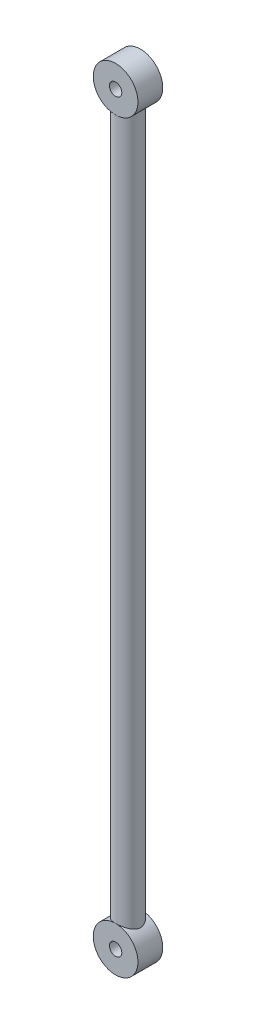
ISO-10303-21;
HEADER;
FILE_DESCRIPTION(('STEP AP214'),'2;1');
FILE_NAME('part.step','',(''),(''),'','','');
FILE_SCHEMA(('AUTOMOTIVE_DESIGN { 1 0 10303 214 1 1 1 1 }'));
ENDSEC;
DATA;
#1=APPLICATION_CONTEXT('core data for automotive mechanical design processes');
#2=APPLICATION_PROTOCOL_DEFINITION('international standard','automotive_design',2000,#1);
#3=PRODUCT_CONTEXT('',#1,'mechanical');
#4=PRODUCT('Part','Part','',(#3));
#5=PRODUCT_RELATED_PRODUCT_CATEGORY('part','',(#4));
#6=PRODUCT_DEFINITION_FORMATION('','',#4);
#7=PRODUCT_DEFINITION_CONTEXT('part definition',#1,'design');
#8=PRODUCT_DEFINITION('design','',#6,#7);
#9=PRODUCT_DEFINITION_SHAPE('','',#8);
#10=(LENGTH_UNIT() NAMED_UNIT(*) SI_UNIT(.MILLI.,.METRE.));
#11=(NAMED_UNIT(*) PLANE_ANGLE_UNIT() SI_UNIT($,.RADIAN.));
#12=(NAMED_UNIT(*) SI_UNIT($,.STERADIAN.) SOLID_ANGLE_UNIT());
#13=UNCERTAINTY_MEASURE_WITH_UNIT(LENGTH_MEASURE(1.E-05),#10,'distance_accuracy_value','');
#14=(GEOMETRIC_REPRESENTATION_CONTEXT(3) GLOBAL_UNCERTAINTY_ASSIGNED_CONTEXT((#13)) GLOBAL_UNIT_ASSIGNED_CONTEXT((#10,
#11,#12)) REPRESENTATION_CONTEXT('',''));
#15=CARTESIAN_POINT('',(0.,0.,0.));
#16=DIRECTION('',(0.,0.,1.));
#17=DIRECTION('',(1.,0.,0.));
#18=AXIS2_PLACEMENT_3D('',#15,#16,#17);
#19=CARTESIAN_POINT('',(0.,150.,0.));
#20=DIRECTION('',(0.,-1.,0.));
#21=DIRECTION('',(0.,0.,-1.));
#22=AXIS2_PLACEMENT_3D('',#19,#20,#21);
#23=CYLINDRICAL_SURFACE('',#22,5.);
#24=CARTESIAN_POINT('',(0.,141.,-5.));
#25=CARTESIAN_POINT('',(-0.129728650098871,140.999999646326,-5.00000040349837));
#26=CARTESIAN_POINT('',(-0.259452073794094,141.002810835245,-4.99494572915852));
#27=CARTESIAN_POINT('',(-0.517921555695225,141.013983381543,-4.9747929956815));
#28=CARTESIAN_POINT('',(-0.646667254114373,141.022346690576,-4.95969140489748));
#29=CARTESIAN_POINT('',(-0.902114816809583,141.044408368666,-4.91964430657611));
#30=CARTESIAN_POINT('',(-1.02881719751598,141.058105366955,-4.89470132827136));
#31=CARTESIAN_POINT('',(-1.27935747075157,141.090498897505,-4.83526936572432));
#32=CARTESIAN_POINT('',(-1.40319416175913,141.109197486989,-4.80077645325704));
#33=CARTESIAN_POINT('',(-1.64664425181187,141.151059393311,-4.72279881871315));
#34=CARTESIAN_POINT('',(-1.76627303289197,141.174203876621,-4.67935197230107));
#35=CARTESIAN_POINT('',(-2.00118015325758,141.224480930736,-4.58381684319522));
#36=CARTESIAN_POINT('',(-2.11645683188321,141.251615004926,-4.53172530199133));
#37=CARTESIAN_POINT('',(-2.45478877397503,141.33812636229,-4.36318845033186));
#38=CARTESIAN_POINT('',(-2.67053417661057,141.402646532724,-4.23441988189425));
#39=CARTESIAN_POINT('',(-3.09271229088071,141.544927587781,-3.93780768634661));
#40=CARTESIAN_POINT('',(-3.29745415964199,141.623297217141,-3.76786951560456));
#41=CARTESIAN_POINT('',(-3.67715998948636,141.782885936079,-3.39835387418638));
#42=CARTESIAN_POINT('',(-3.85209353794295,141.864107835081,-3.19874651689415));
#43=CARTESIAN_POINT('',(-4.18516795747926,142.029907367738,-2.75130582658808));
#44=CARTESIAN_POINT('',(-4.33981028101033,142.113990877573,-2.5006351634021));
#45=CARTESIAN_POINT('',(-4.53792036965586,142.227413371803,-2.10454112170272));
#46=CARTESIAN_POINT('',(-4.59831134885591,142.263101389869,-1.96917342161965));
#47=CARTESIAN_POINT('',(-4.70719976108134,142.328866191986,-1.69244684576201));
#48=CARTESIAN_POINT('',(-4.75570081097955,142.358944681767,-1.55108980730638));
#49=CARTESIAN_POINT('',(-4.86451848682886,142.42749900523,-1.17999431654652));
#50=CARTESIAN_POINT('',(-4.9154532780422,142.460775105057,-0.946409780324293));
#51=CARTESIAN_POINT('',(-4.98336969334309,142.505486049894,-0.472499613023781));
#52=CARTESIAN_POINT('',(-5.0003847861741,142.516942424044,-0.232180864358255));
#53=CARTESIAN_POINT('',(-4.99960164647186,142.516418963688,0.248654352078251));
#54=CARTESIAN_POINT('',(-4.98176529219689,142.504413465757,0.489170748384894));
#55=CARTESIAN_POINT('',(-4.91220969738461,142.458656700871,0.963158075959368));
#56=CARTESIAN_POINT('',(-4.8604684245036,142.424891293967,1.19662432257893));
#57=CARTESIAN_POINT('',(-4.72555331937599,142.340011492925,1.65086354474707));
#58=CARTESIAN_POINT('',(-4.64237249870864,142.288893241833,1.87163368561019));
#59=CARTESIAN_POINT('',(-4.447403175792,142.17482733877,2.29681665358057));
#60=CARTESIAN_POINT('',(-4.33560350009452,142.111875069086,2.50122305090145));
#61=CARTESIAN_POINT('',(-4.06693738507513,141.969652579496,2.92082028624938));
#62=CARTESIAN_POINT('',(-3.90580419516379,141.889356384365,3.13292950403355));
#63=CARTESIAN_POINT('',(-3.55190169354531,141.728256034713,3.52909892787892));
#64=CARTESIAN_POINT('',(-3.35910741508493,141.647451528109,3.7131367752038));
#65=CARTESIAN_POINT('',(-3.0382033469624,141.527444052296,3.97377961796348));
#66=CARTESIAN_POINT('',(-2.91988181005325,141.485842006656,4.06153890281824));
#67=CARTESIAN_POINT('',(-2.67521853140364,141.405831009375,4.22669686748395));
#68=CARTESIAN_POINT('',(-2.54887988004624,141.367420840379,4.30409950416806));
#69=CARTESIAN_POINT('',(-2.28891079019197,141.294880885918,4.44780208557034));
#70=CARTESIAN_POINT('',(-2.15528226330416,141.260749985978,4.51410492258729));
#71=CARTESIAN_POINT('',(-1.88158110652946,141.197763927142,4.63486956287611));
#72=CARTESIAN_POINT('',(-1.7415092634169,141.168908126247,4.68933280722001));
#73=CARTESIAN_POINT('',(-1.46611496312218,141.119196102882,4.78227003245317));
#74=CARTESIAN_POINT('',(-1.33115857131804,141.097918104151,4.82160315398791));
#75=CARTESIAN_POINT('',(-1.05765459084795,141.061297953465,4.88888456177408));
#76=CARTESIAN_POINT('',(-0.919107474489868,141.045955025022,4.91683433733713));
#77=CARTESIAN_POINT('',(-0.639688147055673,141.021667657509,4.96092635164273));
#78=CARTESIAN_POINT('',(-0.498817610939271,141.012718798921,4.97707674617504));
#79=CARTESIAN_POINT('',(-0.215954097478516,141.001478427607,4.99734561333519));
#80=CARTESIAN_POINT('',(-0.0739612319194169,140.999186260042,5.00146526946591));
#81=CARTESIAN_POINT('',(0.193661310485743,141.001204594039,4.99783122654234));
#82=CARTESIAN_POINT('',(0.319316398566548,141.004794217097,4.99137388810731));
#83=CARTESIAN_POINT('',(0.569568337701498,141.017166848495,4.96904196300947));
#84=CARTESIAN_POINT('',(0.694164850128328,141.025951459577,4.9531644700634));
#85=CARTESIAN_POINT('',(0.941327320488136,141.048503489539,4.91218729089601));
#86=CARTESIAN_POINT('',(1.06389401822772,141.062269049266,4.88709104554547));
#87=CARTESIAN_POINT('',(1.30624674826633,141.094456790031,4.82797111413388));
#88=CARTESIAN_POINT('',(1.42603168935623,141.112880765843,4.7939439870273));
#89=CARTESIAN_POINT('',(1.77910695000249,141.174383857993,4.67928639076615));
#90=CARTESIAN_POINT('',(2.00729552902004,141.223807448831,4.58588050325846));
#91=CARTESIAN_POINT('',(2.44488800886299,141.335491250643,4.36833983307571));
#92=CARTESIAN_POINT('',(2.65428686245934,141.397754895942,4.24419682737024));
#93=CARTESIAN_POINT('',(3.07172957903525,141.537275464671,3.95417802770742));
#94=CARTESIAN_POINT('',(3.2774078297305,141.615416360903,3.78531914436469));
#95=CARTESIAN_POINT('',(3.65908152653596,141.774793886285,3.41781320454552));
#96=CARTESIAN_POINT('',(3.83504389654573,141.856033843278,3.21913341346621));
#97=CARTESIAN_POINT('',(4.17023823002669,142.022062682324,2.77387690474419));
#98=CARTESIAN_POINT('',(4.32600004905646,142.10638487079,2.52449151879107));
#99=CARTESIAN_POINT('',(4.59275891633596,142.258534762667,1.998310629477));
#100=CARTESIAN_POINT('',(4.70381927827812,142.326385740882,1.72155459054789));
#101=CARTESIAN_POINT('',(4.85777774830001,142.423161907911,1.2075660720454));
#102=CARTESIAN_POINT('',(4.91005771973348,142.457252553435,0.974117465592754));
#103=CARTESIAN_POINT('',(4.98067851749206,142.503687086165,0.5001067150591));
#104=CARTESIAN_POINT('',(4.99905324495845,142.516052695187,0.259551921162851));
#105=CARTESIAN_POINT('',(5.00087641660015,142.517270761059,-0.222043485471047));
#106=CARTESIAN_POINT('',(4.98428138030365,142.506093945895,-0.463084330288078));
#107=CARTESIAN_POINT('',(4.91703272116073,142.461807764886,-0.938336075562898));
#108=CARTESIAN_POINT('',(4.86635734965788,142.428684393859,-1.17254251494277));
#109=CARTESIAN_POINT('',(4.73359019709714,142.344989469468,-1.62763734061605));
#110=CARTESIAN_POINT('',(4.65159333262122,142.2944706763,-1.84856365254514));
#111=CARTESIAN_POINT('',(4.45898685237774,142.181440664446,-2.2742180217571));
#112=CARTESIAN_POINT('',(4.34836621460618,142.118924828525,-2.47893979950247));
#113=CARTESIAN_POINT('',(4.08239378948778,141.977530736018,-2.89911833750946));
#114=CARTESIAN_POINT('',(3.92281334521187,141.897606410834,-3.11154387864726));
#115=CARTESIAN_POINT('',(3.5720844974269,141.73698781258,-3.50861520411093));
#116=CARTESIAN_POINT('',(3.38091059241464,141.656292967551,-3.69323831498274));
#117=CARTESIAN_POINT('',(3.06226198232625,141.536117675951,-3.95526647080339));
#118=CARTESIAN_POINT('',(2.94454455618601,141.494347342869,-4.04369106289164));
#119=CARTESIAN_POINT('',(2.7010491927211,141.413921579117,-4.21023353314728));
#120=CARTESIAN_POINT('',(2.5752743367119,141.375264970315,-4.28835531675942));
#121=CARTESIAN_POINT('',(2.31639114532811,141.30215990897,-4.43354865083013));
#122=CARTESIAN_POINT('',(2.1832852188068,141.267710085984,-4.5006238024406));
#123=CARTESIAN_POINT('',(1.91056755470907,141.204016483003,-4.62299222804323));
#124=CARTESIAN_POINT('',(1.77095673345216,141.174771972535,-4.67828715539186));
#125=CARTESIAN_POINT('',(1.4991287046809,141.124755990042,-4.77193637345178));
#126=CARTESIAN_POINT('',(1.36737917982357,141.103458417031,-4.81136832122438));
#127=CARTESIAN_POINT('',(1.10033791857096,141.066500295166,-4.87936809681847));
#128=CARTESIAN_POINT('',(0.965046657250147,141.050838994398,-4.90793737381529));
#129=CARTESIAN_POINT('',(0.69208832443313,141.02560377812,-4.95380200961804));
#130=CARTESIAN_POINT('',(0.554422765939969,141.016026123099,-4.97110429421348));
#131=CARTESIAN_POINT('',(0.277836098507389,141.003224582641,-4.9942027849947));
#132=CARTESIAN_POINT('',(0.138915052853811,141.000000378719,-4.99999956792893));
#133=CARTESIAN_POINT('',(0.,141.,-5.));
#134=B_SPLINE_CURVE_WITH_KNOTS('',3,(#24,#25,#26,#27,#28,#29,#30,#31,#32,#33,#34,#35,#36,#37,
#38,#39,#40,#41,#42,#43,#44,#45,#46,#47,#48,#49,#50,#51,#52,#53,#54,#55,#56,#57,#58,#59,#60,#61,
#62,#63,#64,#65,#66,#67,#68,#69,#70,#71,#72,#73,#74,#75,#76,#77,#78,#79,#80,#81,#82,#83,#84,#85,
#86,#87,#88,#89,#90,#91,#92,#93,#94,#95,#96,#97,#98,#99,#100,#101,#102,#103,#104,#105,#106,#107,
#108,#109,#110,#111,#112,#113,#114,#115,#116,#117,#118,#119,#120,#121,#122,#123,#124,#125,#126,
#127,#128,#129,#130,#131,#132,#133),.UNSPECIFIED.,.T.,.F.,(4,2,2,2,2,2,2,2,2,2,2,2,2,2,2,2,2,2,
2,2,2,2,2,2,2,2,2,2,2,2,2,2,2,2,2,2,2,2,2,2,2,2,2,2,2,2,2,2,2,2,2,2,2,2,4),(0.,
0.389049038673795,0.778234906423186,1.16732081864409,1.5565670140197,1.94419928087582,
2.33197799415704,3.10694003691382,3.93579164360748,4.76548390659346,5.67926108729746,
6.13607645300718,6.59275268424475,7.31346839098543,8.03347261109576,8.75426483810454,
9.47552592073737,10.1969474205328,10.9186510103256,11.7500289468904,12.5820656531714,
13.0407937204138,13.4993460219526,13.9577786509196,14.4161554498582,14.8420733324614,
15.2679354732486,15.6935029768355,16.1190286145522,16.4961868590171,16.8734615239821,
17.2505955151925,17.6278750290087,18.3788772686743,19.1300806397395,19.9587345054796,
20.7883047338674,21.7014293455293,22.613256047122,23.335047084232,24.0561160257529,
24.778082054147,25.5005092490547,26.2207643506841,26.9412972109113,27.7704094124313,
28.6001941523198,29.0588132846799,29.5172580673312,29.9755531019594,30.4337837723652,
30.8507153459595,31.2675912777014,31.6842107144439,32.1008092663359),.UNSPECIFIED.);
#135=CARTESIAN_POINT('',(0.,141.,-5.));
#136=VERTEX_POINT('',#135);
#137=CARTESIAN_POINT('',(0.,141.,5.));
#138=VERTEX_POINT('',#137);
#139=EDGE_CURVE('E70',#136,#138,#134,.T.);
#140=ORIENTED_EDGE('',*,*,#139,.F.);
#141=EDGE_CURVE('E57',#138,#136,#134,.T.);
#142=ORIENTED_EDGE('',*,*,#141,.F.);
#143=EDGE_LOOP('',(#140,#142));
#144=FACE_BOUND('',#143,.T.);
#145=CARTESIAN_POINT('',(0.,-141.,-5.));
#146=CARTESIAN_POINT('',(0.129728650098871,-140.999999646326,-5.00000040349837));
#147=CARTESIAN_POINT('',(0.259452073794094,-141.002810835245,-4.99494572915852));
#148=CARTESIAN_POINT('',(0.517921555695225,-141.013983381543,-4.9747929956815));
#149=CARTESIAN_POINT('',(0.646667254114373,-141.022346690576,-4.95969140489748));
#150=CARTESIAN_POINT('',(0.902114816809583,-141.044408368666,-4.91964430657611));
#151=CARTESIAN_POINT('',(1.02881719751598,-141.058105366955,-4.89470132827136));
#152=CARTESIAN_POINT('',(1.27935747075157,-141.090498897505,-4.83526936572432));
#153=CARTESIAN_POINT('',(1.40319416175913,-141.109197486989,-4.80077645325704));
#154=CARTESIAN_POINT('',(1.64664425181187,-141.151059393311,-4.72279881871315));
#155=CARTESIAN_POINT('',(1.76627303289197,-141.174203876621,-4.67935197230107));
#156=CARTESIAN_POINT('',(2.00118015325758,-141.224480930736,-4.58381684319522));
#157=CARTESIAN_POINT('',(2.11645683188321,-141.251615004926,-4.53172530199133));
#158=CARTESIAN_POINT('',(2.45478877397503,-141.33812636229,-4.36318845033186));
#159=CARTESIAN_POINT('',(2.67053417661057,-141.402646532724,-4.23441988189425));
#160=CARTESIAN_POINT('',(3.09271229088071,-141.544927587781,-3.93780768634661));
#161=CARTESIAN_POINT('',(3.29745415964199,-141.623297217141,-3.76786951560456));
#162=CARTESIAN_POINT('',(3.67715998948636,-141.782885936079,-3.39835387418638));
#163=CARTESIAN_POINT('',(3.85209353794295,-141.864107835081,-3.19874651689415));
#164=CARTESIAN_POINT('',(4.18516795747926,-142.029907367738,-2.75130582658808));
#165=CARTESIAN_POINT('',(4.33981028101033,-142.113990877573,-2.5006351634021));
#166=CARTESIAN_POINT('',(4.53792036965586,-142.227413371803,-2.10454112170272));
#167=CARTESIAN_POINT('',(4.59831134885591,-142.263101389869,-1.96917342161965));
#168=CARTESIAN_POINT('',(4.70719976108134,-142.328866191986,-1.69244684576201));
#169=CARTESIAN_POINT('',(4.75570081097955,-142.358944681767,-1.55108980730638));
#170=CARTESIAN_POINT('',(4.86451848682886,-142.42749900523,-1.17999431654652));
#171=CARTESIAN_POINT('',(4.9154532780422,-142.460775105057,-0.946409780324293));
#172=CARTESIAN_POINT('',(4.98336969334309,-142.505486049894,-0.472499613023781));
#173=CARTESIAN_POINT('',(5.0003847861741,-142.516942424044,-0.232180864358255));
#174=CARTESIAN_POINT('',(4.99960164647186,-142.516418963688,0.248654352078251));
#175=CARTESIAN_POINT('',(4.98176529219689,-142.504413465757,0.489170748384894));
#176=CARTESIAN_POINT('',(4.91220969738461,-142.458656700871,0.963158075959368));
#177=CARTESIAN_POINT('',(4.8604684245036,-142.424891293967,1.19662432257893));
#178=CARTESIAN_POINT('',(4.72555331937599,-142.340011492925,1.65086354474707));
#179=CARTESIAN_POINT('',(4.64237249870864,-142.288893241833,1.87163368561019));
#180=CARTESIAN_POINT('',(4.447403175792,-142.17482733877,2.29681665358057));
#181=CARTESIAN_POINT('',(4.33560350009452,-142.111875069086,2.50122305090145));
#182=CARTESIAN_POINT('',(4.06693738507513,-141.969652579496,2.92082028624938));
#183=CARTESIAN_POINT('',(3.90580419516379,-141.889356384365,3.13292950403355));
#184=CARTESIAN_POINT('',(3.55190169354531,-141.728256034713,3.52909892787892));
#185=CARTESIAN_POINT('',(3.35910741508493,-141.647451528109,3.7131367752038));
#186=CARTESIAN_POINT('',(3.0382033469624,-141.527444052296,3.97377961796348));
#187=CARTESIAN_POINT('',(2.91988181005325,-141.485842006656,4.06153890281824));
#188=CARTESIAN_POINT('',(2.67521853140364,-141.405831009375,4.22669686748395));
#189=CARTESIAN_POINT('',(2.54887988004624,-141.367420840379,4.30409950416806));
#190=CARTESIAN_POINT('',(2.28891079019197,-141.294880885918,4.44780208557034));
#191=CARTESIAN_POINT('',(2.15528226330416,-141.260749985978,4.51410492258729));
#192=CARTESIAN_POINT('',(1.88158110652946,-141.197763927142,4.63486956287611));
#193=CARTESIAN_POINT('',(1.7415092634169,-141.168908126247,4.68933280722001));
#194=CARTESIAN_POINT('',(1.46611496312218,-141.119196102882,4.78227003245317));
#195=CARTESIAN_POINT('',(1.33115857131804,-141.097918104151,4.82160315398791));
#196=CARTESIAN_POINT('',(1.05765459084795,-141.061297953465,4.88888456177408));
#197=CARTESIAN_POINT('',(0.919107474489868,-141.045955025022,4.91683433733713));
#198=CARTESIAN_POINT('',(0.639688147055673,-141.021667657509,4.96092635164273));
#199=CARTESIAN_POINT('',(0.498817610939271,-141.012718798921,4.97707674617504));
#200=CARTESIAN_POINT('',(0.215954097478516,-141.001478427607,4.99734561333519));
#201=CARTESIAN_POINT('',(0.0739612319194169,-140.999186260042,5.00146526946591));
#202=CARTESIAN_POINT('',(-0.193661310485743,-141.001204594039,4.99783122654234));
#203=CARTESIAN_POINT('',(-0.319316398566548,-141.004794217097,4.99137388810731));
#204=CARTESIAN_POINT('',(-0.569568337701498,-141.017166848495,4.96904196300947));
#205=CARTESIAN_POINT('',(-0.694164850128328,-141.025951459577,4.9531644700634));
#206=CARTESIAN_POINT('',(-0.941327320488136,-141.048503489539,4.91218729089601));
#207=CARTESIAN_POINT('',(-1.06389401822772,-141.062269049266,4.88709104554547));
#208=CARTESIAN_POINT('',(-1.30624674826633,-141.094456790031,4.82797111413388));
#209=CARTESIAN_POINT('',(-1.42603168935623,-141.112880765843,4.7939439870273));
#210=CARTESIAN_POINT('',(-1.77910695000249,-141.174383857993,4.67928639076615));
#211=CARTESIAN_POINT('',(-2.00729552902004,-141.223807448831,4.58588050325846));
#212=CARTESIAN_POINT('',(-2.44488800886299,-141.335491250643,4.36833983307571));
#213=CARTESIAN_POINT('',(-2.65428686245934,-141.397754895942,4.24419682737024));
#214=CARTESIAN_POINT('',(-3.07172957903525,-141.537275464671,3.95417802770742));
#215=CARTESIAN_POINT('',(-3.2774078297305,-141.615416360903,3.78531914436469));
#216=CARTESIAN_POINT('',(-3.65908152653596,-141.774793886285,3.41781320454552));
#217=CARTESIAN_POINT('',(-3.83504389654573,-141.856033843278,3.21913341346621));
#218=CARTESIAN_POINT('',(-4.17023823002669,-142.022062682324,2.77387690474419));
#219=CARTESIAN_POINT('',(-4.32600004905646,-142.10638487079,2.52449151879107));
#220=CARTESIAN_POINT('',(-4.59275891633596,-142.258534762667,1.998310629477));
#221=CARTESIAN_POINT('',(-4.70381927827812,-142.326385740882,1.72155459054789));
#222=CARTESIAN_POINT('',(-4.85777774830001,-142.423161907911,1.2075660720454));
#223=CARTESIAN_POINT('',(-4.91005771973348,-142.457252553435,0.974117465592754));
#224=CARTESIAN_POINT('',(-4.98067851749206,-142.503687086165,0.5001067150591));
#225=CARTESIAN_POINT('',(-4.99905324495845,-142.516052695187,0.259551921162851));
#226=CARTESIAN_POINT('',(-5.00087641660015,-142.517270761059,-0.222043485471047));
#227=CARTESIAN_POINT('',(-4.98428138030365,-142.506093945895,-0.463084330288078));
#228=CARTESIAN_POINT('',(-4.91703272116073,-142.461807764886,-0.938336075562898));
#229=CARTESIAN_POINT('',(-4.86635734965788,-142.428684393859,-1.17254251494277));
#230=CARTESIAN_POINT('',(-4.73359019709714,-142.344989469468,-1.62763734061605));
#231=CARTESIAN_POINT('',(-4.65159333262122,-142.2944706763,-1.84856365254514));
#232=CARTESIAN_POINT('',(-4.45898685237774,-142.181440664446,-2.2742180217571));
#233=CARTESIAN_POINT('',(-4.34836621460618,-142.118924828525,-2.47893979950247));
#234=CARTESIAN_POINT('',(-4.08239378948778,-141.977530736018,-2.89911833750946));
#235=CARTESIAN_POINT('',(-3.92281334521187,-141.897606410834,-3.11154387864726));
#236=CARTESIAN_POINT('',(-3.5720844974269,-141.73698781258,-3.50861520411093));
#237=CARTESIAN_POINT('',(-3.38091059241464,-141.656292967551,-3.69323831498274));
#238=CARTESIAN_POINT('',(-3.06226198232625,-141.536117675951,-3.95526647080339));
#239=CARTESIAN_POINT('',(-2.94454455618601,-141.494347342869,-4.04369106289164));
#240=CARTESIAN_POINT('',(-2.7010491927211,-141.413921579117,-4.21023353314728));
#241=CARTESIAN_POINT('',(-2.5752743367119,-141.375264970315,-4.28835531675942));
#242=CARTESIAN_POINT('',(-2.31639114532811,-141.30215990897,-4.43354865083013));
#243=CARTESIAN_POINT('',(-2.1832852188068,-141.267710085984,-4.5006238024406));
#244=CARTESIAN_POINT('',(-1.91056755470907,-141.204016483003,-4.62299222804323));
#245=CARTESIAN_POINT('',(-1.77095673345216,-141.174771972535,-4.67828715539186));
#246=CARTESIAN_POINT('',(-1.4991287046809,-141.124755990042,-4.77193637345178));
#247=CARTESIAN_POINT('',(-1.36737917982357,-141.103458417031,-4.81136832122438));
#248=CARTESIAN_POINT('',(-1.10033791857096,-141.066500295166,-4.87936809681847));
#249=CARTESIAN_POINT('',(-0.965046657250147,-141.050838994398,-4.90793737381529));
#250=CARTESIAN_POINT('',(-0.69208832443313,-141.02560377812,-4.95380200961804));
#251=CARTESIAN_POINT('',(-0.554422765939969,-141.016026123099,-4.97110429421348));
#252=CARTESIAN_POINT('',(-0.277836098507389,-141.003224582641,-4.9942027849947));
#253=CARTESIAN_POINT('',(-0.138915052853811,-141.000000378719,-4.99999956792893));
#254=CARTESIAN_POINT('',(0.,-141.,-5.));
#255=B_SPLINE_CURVE_WITH_KNOTS('',3,(#145,#146,#147,#148,#149,#150,#151,#152,#153,#154,#155,
#156,#157,#158,#159,#160,#161,#162,#163,#164,#165,#166,#167,#168,#169,#170,#171,#172,#173,#174,
#175,#176,#177,#178,#179,#180,#181,#182,#183,#184,#185,#186,#187,#188,#189,#190,#191,#192,#193,
#194,#195,#196,#197,#198,#199,#200,#201,#202,#203,#204,#205,#206,#207,#208,#209,#210,#211,#212,
#213,#214,#215,#216,#217,#218,#219,#220,#221,#222,#223,#224,#225,#226,#227,#228,#229,#230,#231,
#232,#233,#234,#235,#236,#237,#238,#239,#240,#241,#242,#243,#244,#245,#246,#247,#248,#249,#250,
#251,#252,#253,#254),.UNSPECIFIED.,.T.,.F.,(4,2,2,2,2,2,2,2,2,2,2,2,2,2,2,2,2,2,2,2,2,2,2,2,2,2,
2,2,2,2,2,2,2,2,2,2,2,2,2,2,2,2,2,2,2,2,2,2,2,2,2,2,2,2,4),(0.,0.389049038673795,
0.778234906423186,1.16732081864409,1.5565670140197,1.94419928087582,2.33197799415704,
3.10694003691382,3.93579164360748,4.76548390659346,5.67926108729746,6.13607645300718,
6.59275268424475,7.31346839098543,8.03347261109576,8.75426483810454,9.47552592073737,
10.1969474205328,10.9186510103256,11.7500289468904,12.5820656531714,13.0407937204138,
13.4993460219526,13.9577786509196,14.4161554498582,14.8420733324614,15.2679354732486,
15.6935029768355,16.1190286145522,16.4961868590171,16.8734615239821,17.2505955151925,
17.6278750290087,18.3788772686743,19.1300806397395,19.9587345054796,20.7883047338674,
21.7014293455293,22.613256047122,23.335047084232,24.0561160257529,24.778082054147,
25.5005092490547,26.2207643506841,26.9412972109113,27.7704094124313,28.6001941523198,
29.0588132846799,29.5172580673312,29.9755531019594,30.4337837723652,30.8507153459595,
31.2675912777014,31.6842107144439,32.1008092663359),.UNSPECIFIED.);
#256=CARTESIAN_POINT('',(0.,-141.,-5.));
#257=VERTEX_POINT('',#256);
#258=CARTESIAN_POINT('',(0.,-141.,5.));
#259=VERTEX_POINT('',#258);
#260=EDGE_CURVE('E11',#257,#259,#255,.T.);
#261=ORIENTED_EDGE('',*,*,#260,.F.);
#262=EDGE_CURVE('E39',#259,#257,#255,.T.);
#263=ORIENTED_EDGE('',*,*,#262,.F.);
#264=EDGE_LOOP('',(#261,#263));
#265=FACE_BOUND('',#264,.T.);
#266=ADVANCED_FACE('F35',(#144,#265),#23,.T.);
#267=CARTESIAN_POINT('',(0.,150.,5.));
#268=DIRECTION('',(0.,0.,-1.));
#269=DIRECTION('',(-1.,0.,0.));
#270=AXIS2_PLACEMENT_3D('',#267,#268,#269);
#271=CYLINDRICAL_SURFACE('',#270,9.);
#272=CARTESIAN_POINT('',(0.,150.,-5.));
#273=DIRECTION('',(0.,0.,1.));
#274=DIRECTION('',(1.,0.,0.));
#275=AXIS2_PLACEMENT_3D('',#272,#273,#274);
#276=CIRCLE('',#275,9.);
#277=EDGE_CURVE('E79',#136,#136,#276,.T.);
#278=ORIENTED_EDGE('',*,*,#277,.T.);
#279=ORIENTED_EDGE('',*,*,#139,.T.);
#280=CARTESIAN_POINT('',(0.,150.,5.));
#281=DIRECTION('',(0.,0.,1.));
#282=DIRECTION('',(1.,0.,0.));
#283=AXIS2_PLACEMENT_3D('',#280,#281,#282);
#284=CIRCLE('',#283,9.);
#285=EDGE_CURVE('E75',#138,#138,#284,.T.);
#286=ORIENTED_EDGE('',*,*,#285,.F.);
#287=ORIENTED_EDGE('',*,*,#141,.T.);
#288=EDGE_LOOP('',(#278,#279,#286,#287));
#289=FACE_BOUND('',#288,.T.);
#290=ADVANCED_FACE('F81',(#289),#271,.T.);
#291=CARTESIAN_POINT('',(0.,150.,5.));
#292=DIRECTION('',(0.,0.,1.));
#293=DIRECTION('',(1.,0.,0.));
#294=AXIS2_PLACEMENT_3D('',#291,#292,#293);
#295=PLANE('',#294);
#296=CARTESIAN_POINT('',(0.,150.,5.));
#297=DIRECTION('',(0.,0.,1.));
#298=DIRECTION('',(1.,0.,0.));
#299=AXIS2_PLACEMENT_3D('',#296,#297,#298);
#300=CIRCLE('',#299,2.5);
#301=CARTESIAN_POINT('',(2.5,150.,5.));
#302=VERTEX_POINT('',#301);
#303=EDGE_CURVE('E125',#302,#302,#300,.T.);
#304=ORIENTED_EDGE('',*,*,#303,.F.);
#305=EDGE_LOOP('',(#304));
#306=FACE_BOUND('',#305,.T.);
#307=ORIENTED_EDGE('',*,*,#285,.T.);
#308=EDGE_LOOP('',(#307));
#309=FACE_BOUND('',#308,.T.);
#310=ADVANCED_FACE('F85',(#306,#309),#295,.T.);
#311=CARTESIAN_POINT('',(0.,150.,-5.));
#312=DIRECTION('',(0.,0.,1.));
#313=DIRECTION('',(1.,0.,0.));
#314=AXIS2_PLACEMENT_3D('',#311,#312,#313);
#315=PLANE('',#314);
#316=CARTESIAN_POINT('',(0.,150.,-5.));
#317=DIRECTION('',(0.,0.,1.));
#318=DIRECTION('',(1.,0.,0.));
#319=AXIS2_PLACEMENT_3D('',#316,#317,#318);
#320=CIRCLE('',#319,2.5);
#321=CARTESIAN_POINT('',(2.5,150.,-5.));
#322=VERTEX_POINT('',#321);
#323=EDGE_CURVE('E121',#322,#322,#320,.F.);
#324=ORIENTED_EDGE('',*,*,#323,.F.);
#325=EDGE_LOOP('',(#324));
#326=FACE_BOUND('',#325,.T.);
#327=ORIENTED_EDGE('',*,*,#277,.F.);
#328=EDGE_LOOP('',(#327));
#329=FACE_BOUND('',#328,.T.);
#330=ADVANCED_FACE('F86',(#326,#329),#315,.F.);
#331=CARTESIAN_POINT('',(0.,-150.,5.));
#332=DIRECTION('',(0.,0.,-1.));
#333=DIRECTION('',(-1.,0.,0.));
#334=AXIS2_PLACEMENT_3D('',#331,#332,#333);
#335=CYLINDRICAL_SURFACE('',#334,9.);
#336=CARTESIAN_POINT('',(0.,-150.,-5.));
#337=DIRECTION('',(0.,0.,1.));
#338=DIRECTION('',(1.,0.,0.));
#339=AXIS2_PLACEMENT_3D('',#336,#337,#338);
#340=CIRCLE('',#339,9.);
#341=EDGE_CURVE('E68',#257,#257,#340,.T.);
#342=ORIENTED_EDGE('',*,*,#341,.T.);
#343=ORIENTED_EDGE('',*,*,#260,.T.);
#344=CARTESIAN_POINT('',(0.,-150.,5.));
#345=DIRECTION('',(0.,0.,1.));
#346=DIRECTION('',(1.,0.,0.));
#347=AXIS2_PLACEMENT_3D('',#344,#345,#346);
#348=CIRCLE('',#347,9.);
#349=EDGE_CURVE('E69',#259,#259,#348,.T.);
#350=ORIENTED_EDGE('',*,*,#349,.F.);
#351=ORIENTED_EDGE('',*,*,#262,.T.);
#352=EDGE_LOOP('',(#342,#343,#350,#351));
#353=FACE_BOUND('',#352,.T.);
#354=ADVANCED_FACE('F66',(#353),#335,.T.);
#355=CARTESIAN_POINT('',(0.,-150.,5.));
#356=DIRECTION('',(0.,0.,1.));
#357=DIRECTION('',(1.,0.,0.));
#358=AXIS2_PLACEMENT_3D('',#355,#356,#357);
#359=PLANE('',#358);
#360=CARTESIAN_POINT('',(0.,-150.,5.));
#361=DIRECTION('',(0.,0.,1.));
#362=DIRECTION('',(1.,0.,0.));
#363=AXIS2_PLACEMENT_3D('',#360,#361,#362);
#364=CIRCLE('',#363,2.5);
#365=CARTESIAN_POINT('',(2.5,-150.,5.));
#366=VERTEX_POINT('',#365);
#367=EDGE_CURVE('E131',#366,#366,#364,.T.);
#368=ORIENTED_EDGE('',*,*,#367,.F.);
#369=EDGE_LOOP('',(#368));
#370=FACE_BOUND('',#369,.T.);
#371=ORIENTED_EDGE('',*,*,#349,.T.);
#372=EDGE_LOOP('',(#371));
#373=FACE_BOUND('',#372,.T.);
#374=ADVANCED_FACE('F95',(#370,#373),#359,.T.);
#375=CARTESIAN_POINT('',(0.,-150.,-5.));
#376=DIRECTION('',(0.,0.,1.));
#377=DIRECTION('',(1.,0.,0.));
#378=AXIS2_PLACEMENT_3D('',#375,#376,#377);
#379=PLANE('',#378);
#380=CARTESIAN_POINT('',(0.,-150.,-5.));
#381=DIRECTION('',(0.,0.,1.));
#382=DIRECTION('',(1.,0.,0.));
#383=AXIS2_PLACEMENT_3D('',#380,#381,#382);
#384=CIRCLE('',#383,2.5);
#385=CARTESIAN_POINT('',(2.5,-150.,-5.));
#386=VERTEX_POINT('',#385);
#387=EDGE_CURVE('E128',#386,#386,#384,.F.);
#388=ORIENTED_EDGE('',*,*,#387,.F.);
#389=EDGE_LOOP('',(#388));
#390=FACE_BOUND('',#389,.T.);
#391=ORIENTED_EDGE('',*,*,#341,.F.);
#392=EDGE_LOOP('',(#391));
#393=FACE_BOUND('',#392,.T.);
#394=ADVANCED_FACE('F96',(#390,#393),#379,.F.);
#395=CARTESIAN_POINT('',(0.,150.,-5.001));
#396=DIRECTION('',(0.,0.,1.));
#397=DIRECTION('',(1.,0.,0.));
#398=AXIS2_PLACEMENT_3D('',#395,#396,#397);
#399=CYLINDRICAL_SURFACE('',#398,2.5);
#400=ORIENTED_EDGE('',*,*,#303,.T.);
#401=EDGE_LOOP('',(#400));
#402=FACE_BOUND('',#401,.T.);
#403=ORIENTED_EDGE('',*,*,#323,.T.);
#404=EDGE_LOOP('',(#403));
#405=FACE_BOUND('',#404,.T.);
#406=ADVANCED_FACE('F99',(#402,#405),#399,.F.);
#407=CARTESIAN_POINT('',(0.,-150.,-5.001));
#408=DIRECTION('',(0.,0.,1.));
#409=DIRECTION('',(1.,0.,0.));
#410=AXIS2_PLACEMENT_3D('',#407,#408,#409);
#411=CYLINDRICAL_SURFACE('',#410,2.5);
#412=ORIENTED_EDGE('',*,*,#367,.T.);
#413=EDGE_LOOP('',(#412));
#414=FACE_BOUND('',#413,.T.);
#415=ORIENTED_EDGE('',*,*,#387,.T.);
#416=EDGE_LOOP('',(#415));
#417=FACE_BOUND('',#416,.T.);
#418=ADVANCED_FACE('F106',(#414,#417),#411,.F.);
#419=CLOSED_SHELL('',(#266,#290,#310,#330,#354,#374,#394,#406,#418));
#420=MANIFOLD_SOLID_BREP('B2',#419);
#421=ADVANCED_BREP_SHAPE_REPRESENTATION('',(#18,#420),#14);
#422=SHAPE_DEFINITION_REPRESENTATION(#9,#421);
ENDSEC;
END-ISO-10303-21;
